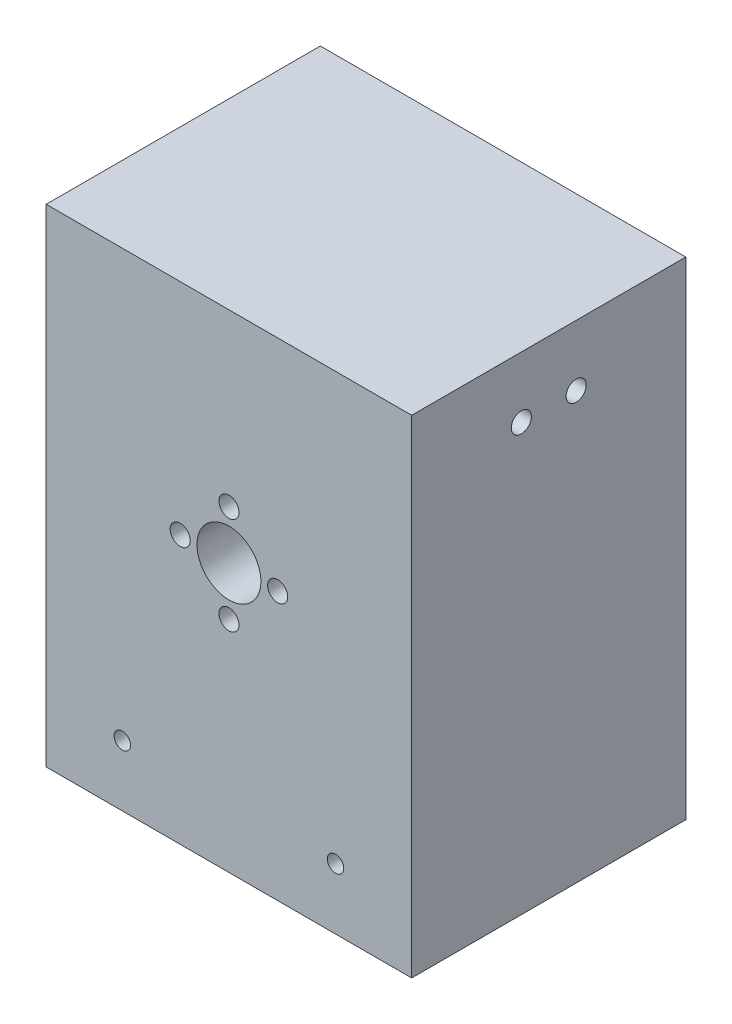
ISO-10303-21;
HEADER;
FILE_DESCRIPTION(('STEP AP214'),'2;1');
FILE_NAME('part.step','',(''),(''),'','','');
FILE_SCHEMA(('AUTOMOTIVE_DESIGN { 1 0 10303 214 1 1 1 1 }'));
ENDSEC;
DATA;
#1=APPLICATION_CONTEXT('core data for automotive mechanical design processes');
#2=APPLICATION_PROTOCOL_DEFINITION('international standard','automotive_design',2000,#1);
#3=PRODUCT_CONTEXT('',#1,'mechanical');
#4=PRODUCT('Part','Part','',(#3));
#5=PRODUCT_RELATED_PRODUCT_CATEGORY('part','',(#4));
#6=PRODUCT_DEFINITION_FORMATION('','',#4);
#7=PRODUCT_DEFINITION_CONTEXT('part definition',#1,'design');
#8=PRODUCT_DEFINITION('design','',#6,#7);
#9=PRODUCT_DEFINITION_SHAPE('','',#8);
#10=(LENGTH_UNIT() NAMED_UNIT(*) SI_UNIT(.MILLI.,.METRE.));
#11=(NAMED_UNIT(*) PLANE_ANGLE_UNIT() SI_UNIT($,.RADIAN.));
#12=(NAMED_UNIT(*) SI_UNIT($,.STERADIAN.) SOLID_ANGLE_UNIT());
#13=UNCERTAINTY_MEASURE_WITH_UNIT(LENGTH_MEASURE(1.E-05),#10,'distance_accuracy_value','');
#14=(GEOMETRIC_REPRESENTATION_CONTEXT(3) GLOBAL_UNCERTAINTY_ASSIGNED_CONTEXT((#13)) GLOBAL_UNIT_ASSIGNED_CONTEXT((#10,
#11,#12)) REPRESENTATION_CONTEXT('',''));
#15=CARTESIAN_POINT('',(0.,0.,0.));
#16=DIRECTION('',(0.,0.,1.));
#17=DIRECTION('',(1.,0.,0.));
#18=AXIS2_PLACEMENT_3D('',#15,#16,#17);
#19=CARTESIAN_POINT('',(-17.5,-30.,-55.));
#20=DIRECTION('',(0.,0.,1.));
#21=DIRECTION('',(1.,0.,0.));
#22=AXIS2_PLACEMENT_3D('',#19,#20,#21);
#23=CYLINDRICAL_SURFACE('',#22,1.35);
#24=CARTESIAN_POINT('',(-17.5,-30.,6.));
#25=DIRECTION('',(0.,0.,-1.));
#26=DIRECTION('',(-1.,0.,0.));
#27=AXIS2_PLACEMENT_3D('',#24,#25,#26);
#28=CIRCLE('',#27,1.35);
#29=CARTESIAN_POINT('',(-18.85,-30.,6.));
#30=VERTEX_POINT('',#29);
#31=EDGE_CURVE('E185',#30,#30,#28,.F.);
#32=ORIENTED_EDGE('',*,*,#31,.T.);
#33=EDGE_LOOP('',(#32));
#34=FACE_BOUND('',#33,.T.);
#35=CARTESIAN_POINT('',(-17.5,-30.,0.));
#36=DIRECTION('',(0.,0.,-1.));
#37=DIRECTION('',(-1.,0.,0.));
#38=AXIS2_PLACEMENT_3D('',#35,#36,#37);
#39=CIRCLE('',#38,1.35);
#40=CARTESIAN_POINT('',(-18.85,-30.,0.));
#41=VERTEX_POINT('',#40);
#42=EDGE_CURVE('E215',#41,#41,#39,.T.);
#43=ORIENTED_EDGE('',*,*,#42,.T.);
#44=EDGE_LOOP('',(#43));
#45=FACE_BOUND('',#44,.T.);
#46=ADVANCED_FACE('F44',(#34,#45),#23,.F.);
#47=CARTESIAN_POINT('',(17.5,-30.,-55.));
#48=DIRECTION('',(0.,0.,1.));
#49=DIRECTION('',(1.,0.,0.));
#50=AXIS2_PLACEMENT_3D('',#47,#48,#49);
#51=CYLINDRICAL_SURFACE('',#50,1.35);
#52=CARTESIAN_POINT('',(17.5,-30.,6.));
#53=DIRECTION('',(0.,0.,-1.));
#54=DIRECTION('',(-1.,0.,0.));
#55=AXIS2_PLACEMENT_3D('',#52,#53,#54);
#56=CIRCLE('',#55,1.35);
#57=CARTESIAN_POINT('',(16.15,-30.,6.));
#58=VERTEX_POINT('',#57);
#59=EDGE_CURVE('E181',#58,#58,#56,.F.);
#60=ORIENTED_EDGE('',*,*,#59,.T.);
#61=EDGE_LOOP('',(#60));
#62=FACE_BOUND('',#61,.T.);
#63=CARTESIAN_POINT('',(17.5,-30.,0.));
#64=DIRECTION('',(0.,0.,-1.));
#65=DIRECTION('',(-1.,0.,0.));
#66=AXIS2_PLACEMENT_3D('',#63,#64,#65);
#67=CIRCLE('',#66,1.35);
#68=CARTESIAN_POINT('',(16.15,-30.,0.));
#69=VERTEX_POINT('',#68);
#70=EDGE_CURVE('E234',#69,#69,#67,.T.);
#71=ORIENTED_EDGE('',*,*,#70,.T.);
#72=EDGE_LOOP('',(#71));
#73=FACE_BOUND('',#72,.T.);
#74=ADVANCED_FACE('F297',(#62,#73),#51,.F.);
#75=CARTESIAN_POINT('',(30.,-40.,45.));
#76=DIRECTION('',(-1.,0.,0.));
#77=DIRECTION('',(0.,0.,1.));
#78=AXIS2_PLACEMENT_3D('',#75,#76,#77);
#79=PLANE('',#78);
#80=CARTESIAN_POINT('',(30.,30.,18.));
#81=DIRECTION('',(1.,0.,0.));
#82=DIRECTION('',(0.,0.,-1.));
#83=AXIS2_PLACEMENT_3D('',#80,#81,#82);
#84=CIRCLE('',#83,1.65);
#85=CARTESIAN_POINT('',(30.,30.,16.35));
#86=VERTEX_POINT('',#85);
#87=EDGE_CURVE('E281',#86,#86,#84,.T.);
#88=ORIENTED_EDGE('',*,*,#87,.F.);
#89=EDGE_LOOP('',(#88));
#90=FACE_BOUND('',#89,.T.);
#91=CARTESIAN_POINT('',(30.,30.,27.));
#92=DIRECTION('',(1.,0.,0.));
#93=DIRECTION('',(0.,0.,-1.));
#94=AXIS2_PLACEMENT_3D('',#91,#92,#93);
#95=CIRCLE('',#94,1.65);
#96=CARTESIAN_POINT('',(30.,30.,25.35));
#97=VERTEX_POINT('',#96);
#98=EDGE_CURVE('E154',#97,#97,#95,.T.);
#99=ORIENTED_EDGE('',*,*,#98,.F.);
#100=EDGE_LOOP('',(#99));
#101=FACE_BOUND('',#100,.T.);
#102=DIRECTION('',(0.,1.,0.));
#103=VECTOR('',#102,1.);
#104=CARTESIAN_POINT('',(30.,-40.,0.));
#105=LINE('',#104,#103);
#106=CARTESIAN_POINT('',(30.,-40.,0.));
#107=VERTEX_POINT('',#106);
#108=CARTESIAN_POINT('',(30.,40.,0.));
#109=VERTEX_POINT('',#108);
#110=EDGE_CURVE('E230',#107,#109,#105,.T.);
#111=ORIENTED_EDGE('',*,*,#110,.T.);
#112=DIRECTION('',(0.,0.,-1.));
#113=VECTOR('',#112,1.);
#114=CARTESIAN_POINT('',(30.,40.,45.));
#115=LINE('',#114,#113);
#116=CARTESIAN_POINT('',(30.,40.,45.));
#117=VERTEX_POINT('',#116);
#118=EDGE_CURVE('E11',#117,#109,#115,.T.);
#119=ORIENTED_EDGE('',*,*,#118,.F.);
#120=DIRECTION('',(0.,1.,0.));
#121=VECTOR('',#120,1.);
#122=CARTESIAN_POINT('',(30.,-40.,45.));
#123=LINE('',#122,#121);
#124=CARTESIAN_POINT('',(30.,-40.,45.));
#125=VERTEX_POINT('',#124);
#126=EDGE_CURVE('E219',#125,#117,#123,.T.);
#127=ORIENTED_EDGE('',*,*,#126,.F.);
#128=DIRECTION('',(0.,0.,-1.));
#129=VECTOR('',#128,1.);
#130=CARTESIAN_POINT('',(30.,-40.,45.));
#131=LINE('',#130,#129);
#132=EDGE_CURVE('E226',#125,#107,#131,.T.);
#133=ORIENTED_EDGE('',*,*,#132,.T.);
#134=EDGE_LOOP('',(#111,#119,#127,#133));
#135=FACE_BOUND('',#134,.T.);
#136=ADVANCED_FACE('F50',(#90,#101,#135),#79,.F.);
#137=CARTESIAN_POINT('',(-30.,40.,45.));
#138=DIRECTION('',(0.,-1.,0.));
#139=DIRECTION('',(0.,0.,-1.));
#140=AXIS2_PLACEMENT_3D('',#137,#138,#139);
#141=PLANE('',#140);
#142=DIRECTION('',(-1.,0.,0.));
#143=VECTOR('',#142,1.);
#144=CARTESIAN_POINT('',(-30.,40.,0.));
#145=LINE('',#144,#143);
#146=CARTESIAN_POINT('',(-30.,40.,0.));
#147=VERTEX_POINT('',#146);
#148=EDGE_CURVE('E231',#109,#147,#145,.T.);
#149=ORIENTED_EDGE('',*,*,#148,.T.);
#150=DIRECTION('',(0.,0.,-1.));
#151=VECTOR('',#150,1.);
#152=CARTESIAN_POINT('',(-30.,40.,45.));
#153=LINE('',#152,#151);
#154=CARTESIAN_POINT('',(-30.,40.,45.));
#155=VERTEX_POINT('',#154);
#156=EDGE_CURVE('E54',#155,#147,#153,.T.);
#157=ORIENTED_EDGE('',*,*,#156,.F.);
#158=DIRECTION('',(-1.,0.,0.));
#159=VECTOR('',#158,1.);
#160=CARTESIAN_POINT('',(-30.,40.,45.));
#161=LINE('',#160,#159);
#162=EDGE_CURVE('E99',#117,#155,#161,.T.);
#163=ORIENTED_EDGE('',*,*,#162,.F.);
#164=ORIENTED_EDGE('',*,*,#118,.T.);
#165=EDGE_LOOP('',(#149,#157,#163,#164));
#166=FACE_BOUND('',#165,.T.);
#167=ADVANCED_FACE('F299',(#166),#141,.F.);
#168=CARTESIAN_POINT('',(-30.,-40.,45.));
#169=DIRECTION('',(1.,0.,0.));
#170=DIRECTION('',(0.,0.,-1.));
#171=AXIS2_PLACEMENT_3D('',#168,#169,#170);
#172=PLANE('',#171);
#173=CARTESIAN_POINT('',(-30.0000000000002,30.,18.));
#174=DIRECTION('',(1.,0.,0.));
#175=DIRECTION('',(0.,0.,-1.));
#176=AXIS2_PLACEMENT_3D('',#173,#174,#175);
#177=CIRCLE('',#176,1.65);
#178=CARTESIAN_POINT('',(-30.0000000000002,30.,16.35));
#179=VERTEX_POINT('',#178);
#180=EDGE_CURVE('E47',#179,#179,#177,.T.);
#181=ORIENTED_EDGE('',*,*,#180,.T.);
#182=EDGE_LOOP('',(#181));
#183=FACE_BOUND('',#182,.T.);
#184=CARTESIAN_POINT('',(-30.0000000000002,30.,27.));
#185=DIRECTION('',(1.,0.,0.));
#186=DIRECTION('',(0.,0.,-1.));
#187=AXIS2_PLACEMENT_3D('',#184,#185,#186);
#188=CIRCLE('',#187,1.65);
#189=CARTESIAN_POINT('',(-30.0000000000002,30.,25.35));
#190=VERTEX_POINT('',#189);
#191=EDGE_CURVE('E279',#190,#190,#188,.T.);
#192=ORIENTED_EDGE('',*,*,#191,.T.);
#193=EDGE_LOOP('',(#192));
#194=FACE_BOUND('',#193,.T.);
#195=DIRECTION('',(0.,-1.,0.));
#196=VECTOR('',#195,1.);
#197=CARTESIAN_POINT('',(-30.,-40.,0.));
#198=LINE('',#197,#196);
#199=CARTESIAN_POINT('',(-30.,-40.,0.));
#200=VERTEX_POINT('',#199);
#201=EDGE_CURVE('E240',#147,#200,#198,.T.);
#202=ORIENTED_EDGE('',*,*,#201,.T.);
#203=DIRECTION('',(0.,0.,-1.));
#204=VECTOR('',#203,1.);
#205=CARTESIAN_POINT('',(-30.,-40.,45.));
#206=LINE('',#205,#204);
#207=CARTESIAN_POINT('',(-30.,-40.,45.));
#208=VERTEX_POINT('',#207);
#209=EDGE_CURVE('E242',#208,#200,#206,.T.);
#210=ORIENTED_EDGE('',*,*,#209,.F.);
#211=DIRECTION('',(0.,-1.,0.));
#212=VECTOR('',#211,1.);
#213=CARTESIAN_POINT('',(-30.,-40.,45.));
#214=LINE('',#213,#212);
#215=EDGE_CURVE('E222',#155,#208,#214,.T.);
#216=ORIENTED_EDGE('',*,*,#215,.F.);
#217=ORIENTED_EDGE('',*,*,#156,.T.);
#218=EDGE_LOOP('',(#202,#210,#216,#217));
#219=FACE_BOUND('',#218,.T.);
#220=ADVANCED_FACE('F307',(#183,#194,#219),#172,.F.);
#221=CARTESIAN_POINT('',(-30.,-40.,45.));
#222=DIRECTION('',(0.,1.,0.));
#223=DIRECTION('',(0.,0.,1.));
#224=AXIS2_PLACEMENT_3D('',#221,#222,#223);
#225=PLANE('',#224);
#226=DIRECTION('',(-1.,0.,0.));
#227=VECTOR('',#226,1.);
#228=CARTESIAN_POINT('',(-24.,-40.,39.));
#229=LINE('',#228,#227);
#230=CARTESIAN_POINT('',(24.,-40.,39.));
#231=VERTEX_POINT('',#230);
#232=CARTESIAN_POINT('',(-24.,-40.,39.));
#233=VERTEX_POINT('',#232);
#234=EDGE_CURVE('E162',#231,#233,#229,.T.);
#235=ORIENTED_EDGE('',*,*,#234,.F.);
#236=DIRECTION('',(0.,0.,1.));
#237=VECTOR('',#236,1.);
#238=CARTESIAN_POINT('',(24.,-40.,6.));
#239=LINE('',#238,#237);
#240=CARTESIAN_POINT('',(24.,-40.,6.));
#241=VERTEX_POINT('',#240);
#242=EDGE_CURVE('E64',#241,#231,#239,.T.);
#243=ORIENTED_EDGE('',*,*,#242,.F.);
#244=DIRECTION('',(1.,0.,0.));
#245=VECTOR('',#244,1.);
#246=CARTESIAN_POINT('',(-24.,-40.,6.));
#247=LINE('',#246,#245);
#248=CARTESIAN_POINT('',(-24.,-40.,6.));
#249=VERTEX_POINT('',#248);
#250=EDGE_CURVE('E147',#249,#241,#247,.T.);
#251=ORIENTED_EDGE('',*,*,#250,.F.);
#252=DIRECTION('',(0.,0.,-1.));
#253=VECTOR('',#252,1.);
#254=CARTESIAN_POINT('',(-24.,-40.,6.));
#255=LINE('',#254,#253);
#256=EDGE_CURVE('E148',#233,#249,#255,.T.);
#257=ORIENTED_EDGE('',*,*,#256,.F.);
#258=EDGE_LOOP('',(#235,#243,#251,#257));
#259=FACE_BOUND('',#258,.T.);
#260=DIRECTION('',(1.,0.,0.));
#261=VECTOR('',#260,1.);
#262=CARTESIAN_POINT('',(-30.,-40.,0.));
#263=LINE('',#262,#261);
#264=EDGE_CURVE('E92',#200,#107,#263,.T.);
#265=ORIENTED_EDGE('',*,*,#264,.T.);
#266=ORIENTED_EDGE('',*,*,#132,.F.);
#267=DIRECTION('',(1.,0.,0.));
#268=VECTOR('',#267,1.);
#269=CARTESIAN_POINT('',(-30.,-40.,45.));
#270=LINE('',#269,#268);
#271=EDGE_CURVE('E75',#208,#125,#270,.T.);
#272=ORIENTED_EDGE('',*,*,#271,.F.);
#273=ORIENTED_EDGE('',*,*,#209,.T.);
#274=EDGE_LOOP('',(#265,#266,#272,#273));
#275=FACE_BOUND('',#274,.T.);
#276=ADVANCED_FACE('F313',(#259,#275),#225,.F.);
#277=CARTESIAN_POINT('',(0.,0.,45.));
#278=DIRECTION('',(0.,0.,-1.));
#279=DIRECTION('',(-1.,0.,0.));
#280=AXIS2_PLACEMENT_3D('',#277,#278,#279);
#281=PLANE('',#280);
#282=CARTESIAN_POINT('',(0.,4.,45.));
#283=DIRECTION('',(0.,0.,1.));
#284=DIRECTION('',(1.,0.,0.));
#285=AXIS2_PLACEMENT_3D('',#282,#283,#284);
#286=CIRCLE('',#285,5.25);
#287=CARTESIAN_POINT('',(5.25,4.,45.));
#288=VERTEX_POINT('',#287);
#289=EDGE_CURVE('E187',#288,#288,#286,.T.);
#290=ORIENTED_EDGE('',*,*,#289,.F.);
#291=EDGE_LOOP('',(#290));
#292=FACE_BOUND('',#291,.T.);
#293=CARTESIAN_POINT('',(8.,4.,45.));
#294=DIRECTION('',(0.,0.,1.));
#295=DIRECTION('',(1.,0.,0.));
#296=AXIS2_PLACEMENT_3D('',#293,#294,#295);
#297=CIRCLE('',#296,1.65);
#298=CARTESIAN_POINT('',(9.65,4.,45.));
#299=VERTEX_POINT('',#298);
#300=EDGE_CURVE('E192',#299,#299,#297,.T.);
#301=ORIENTED_EDGE('',*,*,#300,.F.);
#302=EDGE_LOOP('',(#301));
#303=FACE_BOUND('',#302,.T.);
#304=CARTESIAN_POINT('',(0.,12.,45.));
#305=DIRECTION('',(0.,0.,1.));
#306=DIRECTION('',(1.,0.,0.));
#307=AXIS2_PLACEMENT_3D('',#304,#305,#306);
#308=CIRCLE('',#307,1.65);
#309=CARTESIAN_POINT('',(1.65,12.,45.));
#310=VERTEX_POINT('',#309);
#311=EDGE_CURVE('E196',#310,#310,#308,.T.);
#312=ORIENTED_EDGE('',*,*,#311,.F.);
#313=EDGE_LOOP('',(#312));
#314=FACE_BOUND('',#313,.T.);
#315=CARTESIAN_POINT('',(-8.,4.,45.));
#316=DIRECTION('',(0.,0.,1.));
#317=DIRECTION('',(1.,0.,0.));
#318=AXIS2_PLACEMENT_3D('',#315,#316,#317);
#319=CIRCLE('',#318,1.65);
#320=CARTESIAN_POINT('',(-6.35,4.,45.));
#321=VERTEX_POINT('',#320);
#322=EDGE_CURVE('E200',#321,#321,#319,.T.);
#323=ORIENTED_EDGE('',*,*,#322,.F.);
#324=EDGE_LOOP('',(#323));
#325=FACE_BOUND('',#324,.T.);
#326=CARTESIAN_POINT('',(0.,-4.,45.));
#327=DIRECTION('',(0.,0.,1.));
#328=DIRECTION('',(1.,0.,0.));
#329=AXIS2_PLACEMENT_3D('',#326,#327,#328);
#330=CIRCLE('',#329,1.65);
#331=CARTESIAN_POINT('',(1.65,-4.,45.));
#332=VERTEX_POINT('',#331);
#333=EDGE_CURVE('E203',#332,#332,#330,.T.);
#334=ORIENTED_EDGE('',*,*,#333,.F.);
#335=EDGE_LOOP('',(#334));
#336=FACE_BOUND('',#335,.T.);
#337=CARTESIAN_POINT('',(17.5,-30.,45.));
#338=DIRECTION('',(0.,0.,1.));
#339=DIRECTION('',(1.,0.,0.));
#340=AXIS2_PLACEMENT_3D('',#337,#338,#339);
#341=CIRCLE('',#340,1.35);
#342=CARTESIAN_POINT('',(18.85,-30.,45.));
#343=VERTEX_POINT('',#342);
#344=EDGE_CURVE('E206',#343,#343,#341,.T.);
#345=ORIENTED_EDGE('',*,*,#344,.F.);
#346=EDGE_LOOP('',(#345));
#347=FACE_BOUND('',#346,.T.);
#348=CARTESIAN_POINT('',(-17.5,-30.,45.));
#349=DIRECTION('',(0.,0.,1.));
#350=DIRECTION('',(1.,0.,0.));
#351=AXIS2_PLACEMENT_3D('',#348,#349,#350);
#352=CIRCLE('',#351,1.35);
#353=CARTESIAN_POINT('',(-16.15,-30.,45.));
#354=VERTEX_POINT('',#353);
#355=EDGE_CURVE('E214',#354,#354,#352,.T.);
#356=ORIENTED_EDGE('',*,*,#355,.F.);
#357=EDGE_LOOP('',(#356));
#358=FACE_BOUND('',#357,.T.);
#359=ORIENTED_EDGE('',*,*,#126,.T.);
#360=ORIENTED_EDGE('',*,*,#162,.T.);
#361=ORIENTED_EDGE('',*,*,#215,.T.);
#362=ORIENTED_EDGE('',*,*,#271,.T.);
#363=EDGE_LOOP('',(#359,#360,#361,#362));
#364=FACE_BOUND('',#363,.T.);
#365=ADVANCED_FACE('F339',(#292,#303,#314,#325,#336,#347,#358,#364),#281,.F.);
#366=CARTESIAN_POINT('',(0.,0.,0.));
#367=DIRECTION('',(0.,0.,-1.));
#368=DIRECTION('',(-1.,0.,0.));
#369=AXIS2_PLACEMENT_3D('',#366,#367,#368);
#370=PLANE('',#369);
#371=CARTESIAN_POINT('',(0.,4.,0.));
#372=DIRECTION('',(0.,0.,-1.));
#373=DIRECTION('',(-1.,0.,0.));
#374=AXIS2_PLACEMENT_3D('',#371,#372,#373);
#375=CIRCLE('',#374,5.25);
#376=CARTESIAN_POINT('',(-5.25,4.,0.));
#377=VERTEX_POINT('',#376);
#378=EDGE_CURVE('E188',#377,#377,#375,.T.);
#379=ORIENTED_EDGE('',*,*,#378,.F.);
#380=EDGE_LOOP('',(#379));
#381=FACE_BOUND('',#380,.T.);
#382=CARTESIAN_POINT('',(8.,4.,0.));
#383=DIRECTION('',(0.,0.,-1.));
#384=DIRECTION('',(-1.,0.,0.));
#385=AXIS2_PLACEMENT_3D('',#382,#383,#384);
#386=CIRCLE('',#385,1.65);
#387=CARTESIAN_POINT('',(6.35,4.,0.));
#388=VERTEX_POINT('',#387);
#389=EDGE_CURVE('E217',#388,#388,#386,.T.);
#390=ORIENTED_EDGE('',*,*,#389,.F.);
#391=EDGE_LOOP('',(#390));
#392=FACE_BOUND('',#391,.T.);
#393=CARTESIAN_POINT('',(0.,12.,0.));
#394=DIRECTION('',(0.,0.,-1.));
#395=DIRECTION('',(-1.,0.,0.));
#396=AXIS2_PLACEMENT_3D('',#393,#394,#395);
#397=CIRCLE('',#396,1.65);
#398=CARTESIAN_POINT('',(-1.65,12.,0.));
#399=VERTEX_POINT('',#398);
#400=EDGE_CURVE('E264',#399,#399,#397,.T.);
#401=ORIENTED_EDGE('',*,*,#400,.F.);
#402=EDGE_LOOP('',(#401));
#403=FACE_BOUND('',#402,.T.);
#404=CARTESIAN_POINT('',(-8.,4.,0.));
#405=DIRECTION('',(0.,0.,-1.));
#406=DIRECTION('',(-1.,0.,0.));
#407=AXIS2_PLACEMENT_3D('',#404,#405,#406);
#408=CIRCLE('',#407,1.65);
#409=CARTESIAN_POINT('',(-9.65,4.,0.));
#410=VERTEX_POINT('',#409);
#411=EDGE_CURVE('E256',#410,#410,#408,.T.);
#412=ORIENTED_EDGE('',*,*,#411,.F.);
#413=EDGE_LOOP('',(#412));
#414=FACE_BOUND('',#413,.T.);
#415=CARTESIAN_POINT('',(0.,-4.,0.));
#416=DIRECTION('',(0.,0.,-1.));
#417=DIRECTION('',(-1.,0.,0.));
#418=AXIS2_PLACEMENT_3D('',#415,#416,#417);
#419=CIRCLE('',#418,1.65);
#420=CARTESIAN_POINT('',(-1.65,-4.,0.));
#421=VERTEX_POINT('',#420);
#422=EDGE_CURVE('E193',#421,#421,#419,.T.);
#423=ORIENTED_EDGE('',*,*,#422,.F.);
#424=EDGE_LOOP('',(#423));
#425=FACE_BOUND('',#424,.T.);
#426=ORIENTED_EDGE('',*,*,#70,.F.);
#427=EDGE_LOOP('',(#426));
#428=FACE_BOUND('',#427,.T.);
#429=ORIENTED_EDGE('',*,*,#42,.F.);
#430=EDGE_LOOP('',(#429));
#431=FACE_BOUND('',#430,.T.);
#432=ORIENTED_EDGE('',*,*,#110,.F.);
#433=ORIENTED_EDGE('',*,*,#264,.F.);
#434=ORIENTED_EDGE('',*,*,#201,.F.);
#435=ORIENTED_EDGE('',*,*,#148,.F.);
#436=EDGE_LOOP('',(#432,#433,#434,#435));
#437=FACE_BOUND('',#436,.T.);
#438=ADVANCED_FACE('F306',(#381,#392,#403,#414,#425,#428,#431,#437),#370,.T.);
#439=CARTESIAN_POINT('',(-17.5,-30.,39.));
#440=DIRECTION('',(0.,0.,1.));
#441=DIRECTION('',(1.,0.,0.));
#442=AXIS2_PLACEMENT_3D('',#439,#440,#441);
#443=CIRCLE('',#442,1.35);
#444=CARTESIAN_POINT('',(-16.15,-30.,39.));
#445=VERTEX_POINT('',#444);
#446=EDGE_CURVE('E180',#445,#445,#443,.F.);
#447=ORIENTED_EDGE('',*,*,#446,.T.);
#448=EDGE_LOOP('',(#447));
#449=FACE_BOUND('',#448,.T.);
#450=ORIENTED_EDGE('',*,*,#355,.T.);
#451=EDGE_LOOP('',(#450));
#452=FACE_BOUND('',#451,.T.);
#453=ADVANCED_FACE('F318',(#449,#452),#23,.F.);
#454=CARTESIAN_POINT('',(17.5,-30.,39.));
#455=DIRECTION('',(0.,0.,1.));
#456=DIRECTION('',(1.,0.,0.));
#457=AXIS2_PLACEMENT_3D('',#454,#455,#456);
#458=CIRCLE('',#457,1.35);
#459=CARTESIAN_POINT('',(18.85,-30.,39.));
#460=VERTEX_POINT('',#459);
#461=EDGE_CURVE('E171',#460,#460,#458,.F.);
#462=ORIENTED_EDGE('',*,*,#461,.T.);
#463=EDGE_LOOP('',(#462));
#464=FACE_BOUND('',#463,.T.);
#465=ORIENTED_EDGE('',*,*,#344,.T.);
#466=EDGE_LOOP('',(#465));
#467=FACE_BOUND('',#466,.T.);
#468=ADVANCED_FACE('F327',(#464,#467),#51,.F.);
#469=CARTESIAN_POINT('',(0.,-4.,-55.));
#470=DIRECTION('',(0.,0.,1.));
#471=DIRECTION('',(1.,0.,0.));
#472=AXIS2_PLACEMENT_3D('',#469,#470,#471);
#473=CYLINDRICAL_SURFACE('',#472,1.65);
#474=ORIENTED_EDGE('',*,*,#422,.T.);
#475=EDGE_LOOP('',(#474));
#476=FACE_BOUND('',#475,.T.);
#477=ORIENTED_EDGE('',*,*,#333,.T.);
#478=EDGE_LOOP('',(#477));
#479=FACE_BOUND('',#478,.T.);
#480=ADVANCED_FACE('F337',(#476,#479),#473,.F.);
#481=CARTESIAN_POINT('',(-8.,4.,-55.));
#482=DIRECTION('',(0.,0.,1.));
#483=DIRECTION('',(1.,0.,0.));
#484=AXIS2_PLACEMENT_3D('',#481,#482,#483);
#485=CYLINDRICAL_SURFACE('',#484,1.65);
#486=ORIENTED_EDGE('',*,*,#411,.T.);
#487=EDGE_LOOP('',(#486));
#488=FACE_BOUND('',#487,.T.);
#489=ORIENTED_EDGE('',*,*,#322,.T.);
#490=EDGE_LOOP('',(#489));
#491=FACE_BOUND('',#490,.T.);
#492=ADVANCED_FACE('F386',(#488,#491),#485,.F.);
#493=CARTESIAN_POINT('',(0.,12.,-55.));
#494=DIRECTION('',(0.,0.,1.));
#495=DIRECTION('',(1.,0.,0.));
#496=AXIS2_PLACEMENT_3D('',#493,#494,#495);
#497=CYLINDRICAL_SURFACE('',#496,1.65);
#498=ORIENTED_EDGE('',*,*,#400,.T.);
#499=EDGE_LOOP('',(#498));
#500=FACE_BOUND('',#499,.T.);
#501=ORIENTED_EDGE('',*,*,#311,.T.);
#502=EDGE_LOOP('',(#501));
#503=FACE_BOUND('',#502,.T.);
#504=ADVANCED_FACE('F383',(#500,#503),#497,.F.);
#505=CARTESIAN_POINT('',(8.,4.,-55.));
#506=DIRECTION('',(0.,0.,1.));
#507=DIRECTION('',(1.,0.,0.));
#508=AXIS2_PLACEMENT_3D('',#505,#506,#507);
#509=CYLINDRICAL_SURFACE('',#508,1.65);
#510=ORIENTED_EDGE('',*,*,#389,.T.);
#511=EDGE_LOOP('',(#510));
#512=FACE_BOUND('',#511,.T.);
#513=ORIENTED_EDGE('',*,*,#300,.T.);
#514=EDGE_LOOP('',(#513));
#515=FACE_BOUND('',#514,.T.);
#516=ADVANCED_FACE('F375',(#512,#515),#509,.F.);
#517=CARTESIAN_POINT('',(0.,4.,-955.));
#518=DIRECTION('',(0.,0.,1.));
#519=DIRECTION('',(1.,0.,0.));
#520=AXIS2_PLACEMENT_3D('',#517,#518,#519);
#521=CYLINDRICAL_SURFACE('',#520,5.25);
#522=ORIENTED_EDGE('',*,*,#378,.T.);
#523=EDGE_LOOP('',(#522));
#524=FACE_BOUND('',#523,.T.);
#525=ORIENTED_EDGE('',*,*,#289,.T.);
#526=EDGE_LOOP('',(#525));
#527=FACE_BOUND('',#526,.T.);
#528=ADVANCED_FACE('F361',(#524,#527),#521,.F.);
#529=CARTESIAN_POINT('',(-24.,-15.,6.));
#530=DIRECTION('',(0.,0.,-1.));
#531=DIRECTION('',(-1.,0.,0.));
#532=AXIS2_PLACEMENT_3D('',#529,#530,#531);
#533=PLANE('',#532);
#534=ORIENTED_EDGE('',*,*,#59,.F.);
#535=EDGE_LOOP('',(#534));
#536=FACE_BOUND('',#535,.T.);
#537=ORIENTED_EDGE('',*,*,#250,.T.);
#538=DIRECTION('',(0.,-1.,0.));
#539=VECTOR('',#538,1.);
#540=CARTESIAN_POINT('',(24.,-15.,6.));
#541=LINE('',#540,#539);
#542=CARTESIAN_POINT('',(24.,-15.,6.));
#543=VERTEX_POINT('',#542);
#544=EDGE_CURVE('E166',#543,#241,#541,.T.);
#545=ORIENTED_EDGE('',*,*,#544,.F.);
#546=DIRECTION('',(1.,0.,0.));
#547=VECTOR('',#546,1.);
#548=CARTESIAN_POINT('',(-24.,-15.,6.));
#549=LINE('',#548,#547);
#550=CARTESIAN_POINT('',(-24.,-15.,6.));
#551=VERTEX_POINT('',#550);
#552=EDGE_CURVE('E131',#551,#543,#549,.T.);
#553=ORIENTED_EDGE('',*,*,#552,.F.);
#554=DIRECTION('',(0.,-1.,0.));
#555=VECTOR('',#554,1.);
#556=CARTESIAN_POINT('',(-24.,-15.,6.));
#557=LINE('',#556,#555);
#558=EDGE_CURVE('E175',#551,#249,#557,.T.);
#559=ORIENTED_EDGE('',*,*,#558,.T.);
#560=EDGE_LOOP('',(#537,#545,#553,#559));
#561=FACE_BOUND('',#560,.T.);
#562=ORIENTED_EDGE('',*,*,#31,.F.);
#563=EDGE_LOOP('',(#562));
#564=FACE_BOUND('',#563,.T.);
#565=ADVANCED_FACE('F359',(#536,#561,#564),#533,.F.);
#566=CARTESIAN_POINT('',(-24.,-15.,39.));
#567=DIRECTION('',(0.,0.,1.));
#568=DIRECTION('',(1.,0.,0.));
#569=AXIS2_PLACEMENT_3D('',#566,#567,#568);
#570=PLANE('',#569);
#571=ORIENTED_EDGE('',*,*,#461,.F.);
#572=EDGE_LOOP('',(#571));
#573=FACE_BOUND('',#572,.T.);
#574=ORIENTED_EDGE('',*,*,#234,.T.);
#575=DIRECTION('',(0.,-1.,0.));
#576=VECTOR('',#575,1.);
#577=CARTESIAN_POINT('',(-24.,-15.,39.));
#578=LINE('',#577,#576);
#579=CARTESIAN_POINT('',(-24.,-15.,39.));
#580=VERTEX_POINT('',#579);
#581=EDGE_CURVE('E128',#580,#233,#578,.T.);
#582=ORIENTED_EDGE('',*,*,#581,.F.);
#583=DIRECTION('',(-1.,0.,0.));
#584=VECTOR('',#583,1.);
#585=CARTESIAN_POINT('',(-24.,-15.,39.));
#586=LINE('',#585,#584);
#587=CARTESIAN_POINT('',(24.,-15.,39.));
#588=VERTEX_POINT('',#587);
#589=EDGE_CURVE('E133',#588,#580,#586,.T.);
#590=ORIENTED_EDGE('',*,*,#589,.F.);
#591=DIRECTION('',(0.,-1.,0.));
#592=VECTOR('',#591,1.);
#593=CARTESIAN_POINT('',(24.,-15.,39.));
#594=LINE('',#593,#592);
#595=EDGE_CURVE('E119',#588,#231,#594,.T.);
#596=ORIENTED_EDGE('',*,*,#595,.T.);
#597=EDGE_LOOP('',(#574,#582,#590,#596));
#598=FACE_BOUND('',#597,.T.);
#599=ORIENTED_EDGE('',*,*,#446,.F.);
#600=EDGE_LOOP('',(#599));
#601=FACE_BOUND('',#600,.T.);
#602=ADVANCED_FACE('F135',(#573,#598,#601),#570,.F.);
#603=CARTESIAN_POINT('',(24.,-15.,6.));
#604=DIRECTION('',(1.,0.,0.));
#605=DIRECTION('',(0.,0.,-1.));
#606=AXIS2_PLACEMENT_3D('',#603,#604,#605);
#607=PLANE('',#606);
#608=ORIENTED_EDGE('',*,*,#242,.T.);
#609=ORIENTED_EDGE('',*,*,#595,.F.);
#610=DIRECTION('',(0.,0.,1.));
#611=VECTOR('',#610,1.);
#612=CARTESIAN_POINT('',(24.,-15.,6.));
#613=LINE('',#612,#611);
#614=EDGE_CURVE('E121',#543,#588,#613,.T.);
#615=ORIENTED_EDGE('',*,*,#614,.F.);
#616=ORIENTED_EDGE('',*,*,#544,.T.);
#617=EDGE_LOOP('',(#608,#609,#615,#616));
#618=FACE_BOUND('',#617,.T.);
#619=ADVANCED_FACE('F125',(#618),#607,.F.);
#620=CARTESIAN_POINT('',(-24.,-15.,6.));
#621=DIRECTION('',(-1.,0.,0.));
#622=DIRECTION('',(0.,0.,1.));
#623=AXIS2_PLACEMENT_3D('',#620,#621,#622);
#624=PLANE('',#623);
#625=ORIENTED_EDGE('',*,*,#256,.T.);
#626=ORIENTED_EDGE('',*,*,#558,.F.);
#627=DIRECTION('',(0.,0.,-1.));
#628=VECTOR('',#627,1.);
#629=CARTESIAN_POINT('',(-24.,-15.,6.));
#630=LINE('',#629,#628);
#631=EDGE_CURVE('E142',#580,#551,#630,.T.);
#632=ORIENTED_EDGE('',*,*,#631,.F.);
#633=ORIENTED_EDGE('',*,*,#581,.T.);
#634=EDGE_LOOP('',(#625,#626,#632,#633));
#635=FACE_BOUND('',#634,.T.);
#636=ADVANCED_FACE('F356',(#635),#624,.F.);
#637=CARTESIAN_POINT('',(0.,-15.,0.));
#638=DIRECTION('',(0.,1.,0.));
#639=DIRECTION('',(0.,0.,1.));
#640=AXIS2_PLACEMENT_3D('',#637,#638,#639);
#641=PLANE('',#640);
#642=ORIENTED_EDGE('',*,*,#614,.T.);
#643=ORIENTED_EDGE('',*,*,#589,.T.);
#644=ORIENTED_EDGE('',*,*,#631,.T.);
#645=ORIENTED_EDGE('',*,*,#552,.T.);
#646=EDGE_LOOP('',(#642,#643,#644,#645));
#647=FACE_BOUND('',#646,.T.);
#648=ADVANCED_FACE('F141',(#647),#641,.F.);
#649=CARTESIAN_POINT('',(-4970.,30.,27.));
#650=DIRECTION('',(1.,0.,0.));
#651=DIRECTION('',(0.,0.,-1.));
#652=AXIS2_PLACEMENT_3D('',#649,#650,#651);
#653=CYLINDRICAL_SURFACE('',#652,1.65);
#654=ORIENTED_EDGE('',*,*,#98,.T.);
#655=EDGE_LOOP('',(#654));
#656=FACE_BOUND('',#655,.T.);
#657=ORIENTED_EDGE('',*,*,#191,.F.);
#658=EDGE_LOOP('',(#657));
#659=FACE_BOUND('',#658,.T.);
#660=ADVANCED_FACE('F295',(#656,#659),#653,.F.);
#661=CARTESIAN_POINT('',(-4970.,30.,18.));
#662=DIRECTION('',(1.,0.,0.));
#663=DIRECTION('',(0.,0.,-1.));
#664=AXIS2_PLACEMENT_3D('',#661,#662,#663);
#665=CYLINDRICAL_SURFACE('',#664,1.65);
#666=ORIENTED_EDGE('',*,*,#87,.T.);
#667=EDGE_LOOP('',(#666));
#668=FACE_BOUND('',#667,.T.);
#669=ORIENTED_EDGE('',*,*,#180,.F.);
#670=EDGE_LOOP('',(#669));
#671=FACE_BOUND('',#670,.T.);
#672=ADVANCED_FACE('F490',(#668,#671),#665,.F.);
#673=CLOSED_SHELL('',(#46,#74,#136,#167,#220,#276,#365,#438,#453,#468,#480,#492,#504,#516,#528,
#565,#602,#619,#636,#648,#660,#672));
#674=MANIFOLD_SOLID_BREP('B2',#673);
#675=ADVANCED_BREP_SHAPE_REPRESENTATION('',(#18,#674),#14);
#676=SHAPE_DEFINITION_REPRESENTATION(#9,#675);
ENDSEC;
END-ISO-10303-21;
